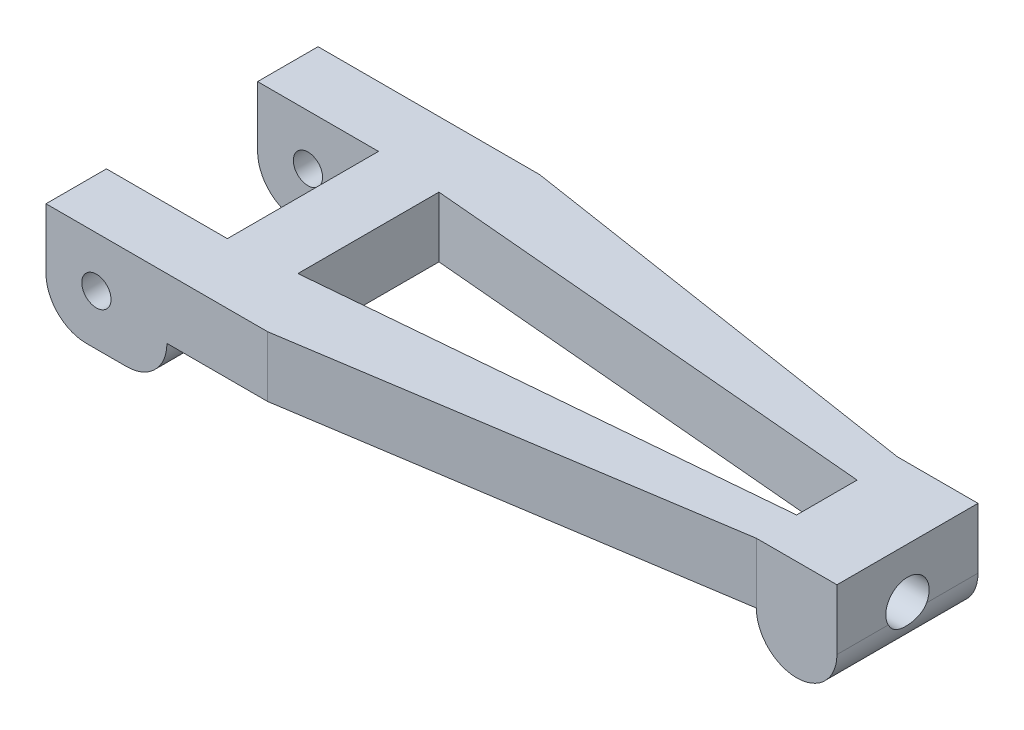
ISO-10303-21;
HEADER;
FILE_DESCRIPTION(('STEP AP214'),'2;1');
FILE_NAME('part.step','',(''),(''),'','','');
FILE_SCHEMA(('AUTOMOTIVE_DESIGN { 1 0 10303 214 1 1 1 1 }'));
ENDSEC;
DATA;
#1=APPLICATION_CONTEXT('core data for automotive mechanical design processes');
#2=APPLICATION_PROTOCOL_DEFINITION('international standard','automotive_design',2000,#1);
#3=PRODUCT_CONTEXT('',#1,'mechanical');
#4=PRODUCT('Part','Part','',(#3));
#5=PRODUCT_RELATED_PRODUCT_CATEGORY('part','',(#4));
#6=PRODUCT_DEFINITION_FORMATION('','',#4);
#7=PRODUCT_DEFINITION_CONTEXT('part definition',#1,'design');
#8=PRODUCT_DEFINITION('design','',#6,#7);
#9=PRODUCT_DEFINITION_SHAPE('','',#8);
#10=(LENGTH_UNIT() NAMED_UNIT(*) SI_UNIT(.MILLI.,.METRE.));
#11=(NAMED_UNIT(*) PLANE_ANGLE_UNIT() SI_UNIT($,.RADIAN.));
#12=(NAMED_UNIT(*) SI_UNIT($,.STERADIAN.) SOLID_ANGLE_UNIT());
#13=UNCERTAINTY_MEASURE_WITH_UNIT(LENGTH_MEASURE(1.E-05),#10,'distance_accuracy_value','');
#14=(GEOMETRIC_REPRESENTATION_CONTEXT(3) GLOBAL_UNCERTAINTY_ASSIGNED_CONTEXT((#13)) GLOBAL_UNIT_ASSIGNED_CONTEXT((#10,
#11,#12)) REPRESENTATION_CONTEXT('',''));
#15=CARTESIAN_POINT('',(0.,0.,0.));
#16=DIRECTION('',(0.,0.,1.));
#17=DIRECTION('',(1.,0.,0.));
#18=AXIS2_PLACEMENT_3D('',#15,#16,#17);
#19=CARTESIAN_POINT('',(0.,0.,0.));
#20=DIRECTION('',(0.,1.,0.));
#21=DIRECTION('',(0.,0.,1.));
#22=AXIS2_PLACEMENT_3D('',#19,#20,#21);
#23=PLANE('',#22);
#24=DIRECTION('',(0.,0.,-1.));
#25=VECTOR('',#24,1.);
#26=CARTESIAN_POINT('',(18.5,0.,20.5));
#27=LINE('',#26,#25);
#28=CARTESIAN_POINT('',(18.5,0.,20.5));
#29=VERTEX_POINT('',#28);
#30=CARTESIAN_POINT('',(18.5,0.,6.5));
#31=VERTEX_POINT('',#30);
#32=EDGE_CURVE('E224',#29,#31,#27,.T.);
#33=ORIENTED_EDGE('',*,*,#32,.F.);
#34=DIRECTION('',(-0.996157987955848,0.,0.0875743286115032));
#35=VECTOR('',#34,1.);
#36=CARTESIAN_POINT('',(64.,0.,16.5));
#37=LINE('',#36,#35);
#38=CARTESIAN_POINT('',(64.,0.,16.5));
#39=VERTEX_POINT('',#38);
#40=EDGE_CURVE('E203',#39,#29,#37,.T.);
#41=ORIENTED_EDGE('',*,*,#40,.F.);
#42=DIRECTION('',(0.,0.,-1.));
#43=VECTOR('',#42,1.);
#44=CARTESIAN_POINT('',(64.,0.,20.5));
#45=LINE('',#44,#43);
#46=CARTESIAN_POINT('',(64.,0.,20.5));
#47=VERTEX_POINT('',#46);
#48=EDGE_CURVE('E288',#47,#39,#45,.T.);
#49=ORIENTED_EDGE('',*,*,#48,.F.);
#50=DIRECTION('',(0.988235294117647,0.,-0.152941176470588));
#51=VECTOR('',#50,1.);
#52=CARTESIAN_POINT('',(64.,0.,20.5));
#53=LINE('',#52,#51);
#54=CARTESIAN_POINT('',(22.,0.,27.));
#55=VERTEX_POINT('',#54);
#56=EDGE_CURVE('E271',#55,#47,#53,.T.);
#57=ORIENTED_EDGE('',*,*,#56,.F.);
#58=DIRECTION('',(1.,0.,0.));
#59=VECTOR('',#58,1.);
#60=CARTESIAN_POINT('',(0.,0.,27.));
#61=LINE('',#60,#59);
#62=CARTESIAN_POINT('',(12.,0.,27.));
#63=VERTEX_POINT('',#62);
#64=EDGE_CURVE('E310',#63,#55,#61,.T.);
#65=ORIENTED_EDGE('',*,*,#64,.F.);
#66=DIRECTION('',(0.,0.,1.));
#67=VECTOR('',#66,1.);
#68=CARTESIAN_POINT('',(12.,0.,27.));
#69=LINE('',#68,#67);
#70=CARTESIAN_POINT('',(12.,0.,21.));
#71=VERTEX_POINT('',#70);
#72=EDGE_CURVE('E237',#71,#63,#69,.T.);
#73=ORIENTED_EDGE('',*,*,#72,.F.);
#74=DIRECTION('',(0.,0.,-1.));
#75=VECTOR('',#74,1.);
#76=CARTESIAN_POINT('',(12.,0.,21.));
#77=LINE('',#76,#75);
#78=CARTESIAN_POINT('',(12.,0.,6.));
#79=VERTEX_POINT('',#78);
#80=EDGE_CURVE('E296',#71,#79,#77,.T.);
#81=ORIENTED_EDGE('',*,*,#80,.T.);
#82=DIRECTION('',(0.,0.,1.));
#83=VECTOR('',#82,1.);
#84=CARTESIAN_POINT('',(12.,0.,0.));
#85=LINE('',#84,#83);
#86=CARTESIAN_POINT('',(12.,0.,0.));
#87=VERTEX_POINT('',#86);
#88=EDGE_CURVE('E248',#87,#79,#85,.T.);
#89=ORIENTED_EDGE('',*,*,#88,.F.);
#90=DIRECTION('',(-1.,0.,0.));
#91=VECTOR('',#90,1.);
#92=CARTESIAN_POINT('',(0.,0.,0.));
#93=LINE('',#92,#91);
#94=CARTESIAN_POINT('',(22.,0.,0.));
#95=VERTEX_POINT('',#94);
#96=EDGE_CURVE('E330',#95,#87,#93,.T.);
#97=ORIENTED_EDGE('',*,*,#96,.F.);
#98=DIRECTION('',(-0.988235294117647,0.,-0.152941176470588));
#99=VECTOR('',#98,1.);
#100=CARTESIAN_POINT('',(64.,0.,6.5));
#101=LINE('',#100,#99);
#102=CARTESIAN_POINT('',(64.,0.,6.5));
#103=VERTEX_POINT('',#102);
#104=EDGE_CURVE('E257',#103,#95,#101,.T.);
#105=ORIENTED_EDGE('',*,*,#104,.F.);
#106=CARTESIAN_POINT('',(64.,0.,10.5));
#107=VERTEX_POINT('',#106);
#108=EDGE_CURVE('E285',#107,#103,#45,.T.);
#109=ORIENTED_EDGE('',*,*,#108,.F.);
#110=DIRECTION('',(0.996157987955848,0.,0.0875743286115032));
#111=VECTOR('',#110,1.);
#112=CARTESIAN_POINT('',(18.5,0.,6.5));
#113=LINE('',#112,#111);
#114=EDGE_CURVE('E221',#31,#107,#113,.T.);
#115=ORIENTED_EDGE('',*,*,#114,.F.);
#116=EDGE_LOOP('',(#33,#41,#49,#57,#65,#73,#81,#89,#97,#105,#109,#115));
#117=FACE_BOUND('',#116,.T.);
#118=ADVANCED_FACE('F33',(#117),#23,.F.);
#119=CARTESIAN_POINT('',(0.,6.,0.));
#120=DIRECTION('',(1.,0.,0.));
#121=DIRECTION('',(0.,0.,-1.));
#122=AXIS2_PLACEMENT_3D('',#119,#120,#121);
#123=PLANE('',#122);
#124=DIRECTION('',(0.,-1.,0.));
#125=VECTOR('',#124,1.);
#126=CARTESIAN_POINT('',(0.,6.,0.));
#127=LINE('',#126,#125);
#128=CARTESIAN_POINT('',(0.,6.,0.));
#129=VERTEX_POINT('',#128);
#130=CARTESIAN_POINT('',(0.,0.,0.));
#131=VERTEX_POINT('',#130);
#132=EDGE_CURVE('E328',#129,#131,#127,.T.);
#133=ORIENTED_EDGE('',*,*,#132,.T.);
#134=DIRECTION('',(0.,0.,-1.));
#135=VECTOR('',#134,1.);
#136=CARTESIAN_POINT('',(0.,0.,0.));
#137=LINE('',#136,#135);
#138=CARTESIAN_POINT('',(0.,0.,6.));
#139=VERTEX_POINT('',#138);
#140=EDGE_CURVE('E49',#131,#139,#137,.F.);
#141=ORIENTED_EDGE('',*,*,#140,.T.);
#142=DIRECTION('',(0.,1.,0.));
#143=VECTOR('',#142,1.);
#144=CARTESIAN_POINT('',(0.,0.,6.));
#145=LINE('',#144,#143);
#146=CARTESIAN_POINT('',(0.,6.,6.));
#147=VERTEX_POINT('',#146);
#148=EDGE_CURVE('E308',#139,#147,#145,.T.);
#149=ORIENTED_EDGE('',*,*,#148,.T.);
#150=DIRECTION('',(0.,0.,1.));
#151=VECTOR('',#150,1.);
#152=CARTESIAN_POINT('',(0.,6.,0.));
#153=LINE('',#152,#151);
#154=EDGE_CURVE('E316',#129,#147,#153,.T.);
#155=ORIENTED_EDGE('',*,*,#154,.F.);
#156=EDGE_LOOP('',(#133,#141,#149,#155));
#157=FACE_BOUND('',#156,.T.);
#158=ADVANCED_FACE('F430',(#157),#123,.F.);
#159=DIRECTION('',(0.,1.,0.));
#160=VECTOR('',#159,1.);
#161=CARTESIAN_POINT('',(0.,0.,21.));
#162=LINE('',#161,#160);
#163=CARTESIAN_POINT('',(0.,0.,21.));
#164=VERTEX_POINT('',#163);
#165=CARTESIAN_POINT('',(0.,6.,21.));
#166=VERTEX_POINT('',#165);
#167=EDGE_CURVE('E299',#164,#166,#162,.T.);
#168=ORIENTED_EDGE('',*,*,#167,.F.);
#169=DIRECTION('',(0.,0.,-1.));
#170=VECTOR('',#169,1.);
#171=CARTESIAN_POINT('',(0.,0.,27.));
#172=LINE('',#171,#170);
#173=CARTESIAN_POINT('',(0.,0.,27.));
#174=VERTEX_POINT('',#173);
#175=EDGE_CURVE('E516',#164,#174,#172,.F.);
#176=ORIENTED_EDGE('',*,*,#175,.T.);
#177=DIRECTION('',(0.,-1.,0.));
#178=VECTOR('',#177,1.);
#179=CARTESIAN_POINT('',(0.,6.,27.));
#180=LINE('',#179,#178);
#181=CARTESIAN_POINT('',(0.,6.,27.));
#182=VERTEX_POINT('',#181);
#183=EDGE_CURVE('E334',#182,#174,#180,.T.);
#184=ORIENTED_EDGE('',*,*,#183,.F.);
#185=EDGE_CURVE('E320',#166,#182,#153,.T.);
#186=ORIENTED_EDGE('',*,*,#185,.F.);
#187=EDGE_LOOP('',(#168,#176,#184,#186));
#188=FACE_BOUND('',#187,.T.);
#189=ADVANCED_FACE('F442',(#188),#123,.F.);
#190=CARTESIAN_POINT('',(0.,6.,27.));
#191=DIRECTION('',(0.,0.,-1.));
#192=DIRECTION('',(-1.,0.,0.));
#193=AXIS2_PLACEMENT_3D('',#190,#191,#192);
#194=PLANE('',#193);
#195=CARTESIAN_POINT('',(5.,1.,27.));
#196=DIRECTION('',(0.,0.,-1.));
#197=DIRECTION('',(-1.,0.,0.));
#198=AXIS2_PLACEMENT_3D('',#195,#196,#197);
#199=CIRCLE('',#198,1.45);
#200=CARTESIAN_POINT('',(3.55,1.,27.));
#201=VERTEX_POINT('',#200);
#202=EDGE_CURVE('E344',#201,#201,#199,.T.);
#203=ORIENTED_EDGE('',*,*,#202,.T.);
#204=EDGE_LOOP('',(#203));
#205=FACE_BOUND('',#204,.T.);
#206=ORIENTED_EDGE('',*,*,#183,.T.);
#207=CARTESIAN_POINT('',(4.,0.,27.));
#208=DIRECTION('',(0.,0.,-1.));
#209=DIRECTION('',(-1.,0.,0.));
#210=AXIS2_PLACEMENT_3D('',#207,#208,#209);
#211=CIRCLE('',#210,4.);
#212=CARTESIAN_POINT('',(4.,-4.,27.));
#213=VERTEX_POINT('',#212);
#214=EDGE_CURVE('E512',#174,#213,#211,.F.);
#215=ORIENTED_EDGE('',*,*,#214,.T.);
#216=DIRECTION('',(-1.,0.,0.));
#217=VECTOR('',#216,1.);
#218=CARTESIAN_POINT('',(0.,-4.,27.));
#219=LINE('',#218,#217);
#220=CARTESIAN_POINT('',(8.,-4.,27.));
#221=VERTEX_POINT('',#220);
#222=EDGE_CURVE('E245',#221,#213,#219,.T.);
#223=ORIENTED_EDGE('',*,*,#222,.F.);
#224=CARTESIAN_POINT('',(8.,0.,27.));
#225=DIRECTION('',(0.,0.,-1.));
#226=DIRECTION('',(-1.,0.,0.));
#227=AXIS2_PLACEMENT_3D('',#224,#225,#226);
#228=CIRCLE('',#227,4.);
#229=EDGE_CURVE('E514',#221,#63,#228,.F.);
#230=ORIENTED_EDGE('',*,*,#229,.T.);
#231=ORIENTED_EDGE('',*,*,#64,.T.);
#232=DIRECTION('',(0.,-1.,0.));
#233=VECTOR('',#232,1.);
#234=CARTESIAN_POINT('',(22.,6.,27.));
#235=LINE('',#234,#233);
#236=CARTESIAN_POINT('',(22.,6.,27.));
#237=VERTEX_POINT('',#236);
#238=EDGE_CURVE('E280',#237,#55,#235,.T.);
#239=ORIENTED_EDGE('',*,*,#238,.F.);
#240=DIRECTION('',(1.,0.,0.));
#241=VECTOR('',#240,1.);
#242=CARTESIAN_POINT('',(0.,6.,27.));
#243=LINE('',#242,#241);
#244=EDGE_CURVE('E319',#182,#237,#243,.T.);
#245=ORIENTED_EDGE('',*,*,#244,.F.);
#246=EDGE_LOOP('',(#206,#215,#223,#230,#231,#239,#245));
#247=FACE_BOUND('',#246,.T.);
#248=ADVANCED_FACE('F438',(#205,#247),#194,.F.);
#249=CARTESIAN_POINT('',(72.,6.,0.));
#250=DIRECTION('',(-1.,0.,0.));
#251=DIRECTION('',(0.,0.,1.));
#252=AXIS2_PLACEMENT_3D('',#249,#250,#251);
#253=PLANE('',#252);
#254=DIRECTION('',(0.,1.,0.));
#255=VECTOR('',#254,1.);
#256=CARTESIAN_POINT('',(72.,-4.,20.5));
#257=LINE('',#256,#255);
#258=CARTESIAN_POINT('',(72.,0.,20.5));
#259=VERTEX_POINT('',#258);
#260=CARTESIAN_POINT('',(72.,6.,20.5));
#261=VERTEX_POINT('',#260);
#262=EDGE_CURVE('E293',#259,#261,#257,.T.);
#263=ORIENTED_EDGE('',*,*,#262,.F.);
#264=DIRECTION('',(0.,0.,1.));
#265=VECTOR('',#264,1.);
#266=CARTESIAN_POINT('',(72.,0.,0.));
#267=LINE('',#266,#265);
#268=CARTESIAN_POINT('',(72.,0.,15.4032866310674));
#269=VERTEX_POINT('',#268);
#270=EDGE_CURVE('E11',#259,#269,#267,.F.);
#271=ORIENTED_EDGE('',*,*,#270,.T.);
#272=CARTESIAN_POINT('',(72.,1.,13.5));
#273=DIRECTION('',(1.,0.,0.));
#274=DIRECTION('',(0.,0.,-1.));
#275=AXIS2_PLACEMENT_3D('',#272,#273,#274);
#276=CIRCLE('',#275,2.15);
#277=CARTESIAN_POINT('',(72.,0.,11.5967133689326));
#278=VERTEX_POINT('',#277);
#279=EDGE_CURVE('E227',#278,#269,#276,.T.);
#280=ORIENTED_EDGE('',*,*,#279,.F.);
#281=DIRECTION('',(0.,0.,1.));
#282=VECTOR('',#281,1.);
#283=CARTESIAN_POINT('',(72.,0.,0.));
#284=LINE('',#283,#282);
#285=CARTESIAN_POINT('',(72.,0.,6.5));
#286=VERTEX_POINT('',#285);
#287=EDGE_CURVE('E42',#278,#286,#284,.F.);
#288=ORIENTED_EDGE('',*,*,#287,.T.);
#289=DIRECTION('',(0.,1.,0.));
#290=VECTOR('',#289,1.);
#291=CARTESIAN_POINT('',(72.,-4.,6.5));
#292=LINE('',#291,#290);
#293=CARTESIAN_POINT('',(72.,6.,6.5));
#294=VERTEX_POINT('',#293);
#295=EDGE_CURVE('E291',#286,#294,#292,.T.);
#296=ORIENTED_EDGE('',*,*,#295,.T.);
#297=DIRECTION('',(0.,0.,-1.));
#298=VECTOR('',#297,1.);
#299=CARTESIAN_POINT('',(72.,6.,0.));
#300=LINE('',#299,#298);
#301=EDGE_CURVE('E323',#261,#294,#300,.T.);
#302=ORIENTED_EDGE('',*,*,#301,.F.);
#303=EDGE_LOOP('',(#263,#271,#280,#288,#296,#302));
#304=FACE_BOUND('',#303,.T.);
#305=ADVANCED_FACE('F434',(#304),#253,.F.);
#306=CARTESIAN_POINT('',(0.,6.,0.));
#307=DIRECTION('',(0.,0.,1.));
#308=DIRECTION('',(1.,0.,0.));
#309=AXIS2_PLACEMENT_3D('',#306,#307,#308);
#310=PLANE('',#309);
#311=CARTESIAN_POINT('',(5.,1.,0.));
#312=DIRECTION('',(0.,0.,-1.));
#313=DIRECTION('',(-1.,0.,0.));
#314=AXIS2_PLACEMENT_3D('',#311,#312,#313);
#315=CIRCLE('',#314,1.45);
#316=CARTESIAN_POINT('',(3.55,1.,0.));
#317=VERTEX_POINT('',#316);
#318=EDGE_CURVE('E481',#317,#317,#315,.T.);
#319=ORIENTED_EDGE('',*,*,#318,.F.);
#320=EDGE_LOOP('',(#319));
#321=FACE_BOUND('',#320,.T.);
#322=DIRECTION('',(1.,0.,0.));
#323=VECTOR('',#322,1.);
#324=CARTESIAN_POINT('',(0.,-4.,0.));
#325=LINE('',#324,#323);
#326=CARTESIAN_POINT('',(4.,-4.,0.));
#327=VERTEX_POINT('',#326);
#328=CARTESIAN_POINT('',(8.,-4.,0.));
#329=VERTEX_POINT('',#328);
#330=EDGE_CURVE('E251',#327,#329,#325,.T.);
#331=ORIENTED_EDGE('',*,*,#330,.F.);
#332=CARTESIAN_POINT('',(4.,0.,0.));
#333=DIRECTION('',(0.,0.,1.));
#334=DIRECTION('',(1.,0.,0.));
#335=AXIS2_PLACEMENT_3D('',#332,#333,#334);
#336=CIRCLE('',#335,4.);
#337=EDGE_CURVE('E57',#327,#131,#336,.F.);
#338=ORIENTED_EDGE('',*,*,#337,.T.);
#339=ORIENTED_EDGE('',*,*,#132,.F.);
#340=DIRECTION('',(-1.,0.,0.));
#341=VECTOR('',#340,1.);
#342=CARTESIAN_POINT('',(0.,6.,0.));
#343=LINE('',#342,#341);
#344=CARTESIAN_POINT('',(22.,6.,0.));
#345=VERTEX_POINT('',#344);
#346=EDGE_CURVE('E326',#345,#129,#343,.T.);
#347=ORIENTED_EDGE('',*,*,#346,.F.);
#348=DIRECTION('',(0.,-1.,0.));
#349=VECTOR('',#348,1.);
#350=CARTESIAN_POINT('',(22.,6.,0.));
#351=LINE('',#350,#349);
#352=EDGE_CURVE('E268',#345,#95,#351,.T.);
#353=ORIENTED_EDGE('',*,*,#352,.T.);
#354=ORIENTED_EDGE('',*,*,#96,.T.);
#355=CARTESIAN_POINT('',(8.,0.,0.));
#356=DIRECTION('',(0.,0.,1.));
#357=DIRECTION('',(1.,0.,0.));
#358=AXIS2_PLACEMENT_3D('',#355,#356,#357);
#359=CIRCLE('',#358,4.);
#360=EDGE_CURVE('E504',#87,#329,#359,.F.);
#361=ORIENTED_EDGE('',*,*,#360,.T.);
#362=EDGE_LOOP('',(#331,#338,#339,#347,#353,#354,#361));
#363=FACE_BOUND('',#362,.T.);
#364=ADVANCED_FACE('F427',(#321,#363),#310,.F.);
#365=CARTESIAN_POINT('',(0.,6.,0.));
#366=DIRECTION('',(0.,1.,0.));
#367=DIRECTION('',(0.,0.,1.));
#368=AXIS2_PLACEMENT_3D('',#365,#366,#367);
#369=PLANE('',#368);
#370=DIRECTION('',(-0.996157987955848,0.,0.0875743286115032));
#371=VECTOR('',#370,1.);
#372=CARTESIAN_POINT('',(64.,6.,16.5));
#373=LINE('',#372,#371);
#374=CARTESIAN_POINT('',(64.,6.,16.5));
#375=VERTEX_POINT('',#374);
#376=CARTESIAN_POINT('',(18.5,6.,20.5));
#377=VERTEX_POINT('',#376);
#378=EDGE_CURVE('E200',#375,#377,#373,.T.);
#379=ORIENTED_EDGE('',*,*,#378,.T.);
#380=DIRECTION('',(0.,0.,-1.));
#381=VECTOR('',#380,1.);
#382=CARTESIAN_POINT('',(18.5,6.,20.5));
#383=LINE('',#382,#381);
#384=CARTESIAN_POINT('',(18.5,6.,6.5));
#385=VERTEX_POINT('',#384);
#386=EDGE_CURVE('E212',#377,#385,#383,.T.);
#387=ORIENTED_EDGE('',*,*,#386,.T.);
#388=DIRECTION('',(0.996157987955848,0.,0.0875743286115032));
#389=VECTOR('',#388,1.);
#390=CARTESIAN_POINT('',(18.5,6.,6.5));
#391=LINE('',#390,#389);
#392=CARTESIAN_POINT('',(64.,6.,10.5));
#393=VERTEX_POINT('',#392);
#394=EDGE_CURVE('E216',#385,#393,#391,.T.);
#395=ORIENTED_EDGE('',*,*,#394,.T.);
#396=DIRECTION('',(0.,0.,1.));
#397=VECTOR('',#396,1.);
#398=CARTESIAN_POINT('',(64.,6.,10.5));
#399=LINE('',#398,#397);
#400=EDGE_CURVE('E208',#393,#375,#399,.T.);
#401=ORIENTED_EDGE('',*,*,#400,.T.);
#402=EDGE_LOOP('',(#379,#387,#395,#401));
#403=FACE_BOUND('',#402,.T.);
#404=DIRECTION('',(-1.,0.,0.));
#405=VECTOR('',#404,1.);
#406=CARTESIAN_POINT('',(72.,6.,6.5));
#407=LINE('',#406,#405);
#408=CARTESIAN_POINT('',(64.,6.,6.5));
#409=VERTEX_POINT('',#408);
#410=EDGE_CURVE('E260',#294,#409,#407,.T.);
#411=ORIENTED_EDGE('',*,*,#410,.T.);
#412=DIRECTION('',(-0.988235294117647,0.,-0.152941176470588));
#413=VECTOR('',#412,1.);
#414=CARTESIAN_POINT('',(64.,6.,6.5));
#415=LINE('',#414,#413);
#416=EDGE_CURVE('E263',#409,#345,#415,.T.);
#417=ORIENTED_EDGE('',*,*,#416,.T.);
#418=ORIENTED_EDGE('',*,*,#346,.T.);
#419=ORIENTED_EDGE('',*,*,#154,.T.);
#420=DIRECTION('',(-1.,0.,0.));
#421=VECTOR('',#420,1.);
#422=CARTESIAN_POINT('',(0.,6.,6.));
#423=LINE('',#422,#421);
#424=CARTESIAN_POINT('',(12.,6.,6.));
#425=VERTEX_POINT('',#424);
#426=EDGE_CURVE('E300',#425,#147,#423,.T.);
#427=ORIENTED_EDGE('',*,*,#426,.F.);
#428=DIRECTION('',(0.,0.,-1.));
#429=VECTOR('',#428,1.);
#430=CARTESIAN_POINT('',(12.,6.,21.));
#431=LINE('',#430,#429);
#432=CARTESIAN_POINT('',(12.,6.,21.));
#433=VERTEX_POINT('',#432);
#434=EDGE_CURVE('E303',#433,#425,#431,.T.);
#435=ORIENTED_EDGE('',*,*,#434,.F.);
#436=DIRECTION('',(1.,0.,0.));
#437=VECTOR('',#436,1.);
#438=CARTESIAN_POINT('',(0.,6.,21.));
#439=LINE('',#438,#437);
#440=EDGE_CURVE('E295',#166,#433,#439,.T.);
#441=ORIENTED_EDGE('',*,*,#440,.F.);
#442=ORIENTED_EDGE('',*,*,#185,.T.);
#443=ORIENTED_EDGE('',*,*,#244,.T.);
#444=DIRECTION('',(0.988235294117647,0.,-0.152941176470588));
#445=VECTOR('',#444,1.);
#446=CARTESIAN_POINT('',(64.,6.,20.5));
#447=LINE('',#446,#445);
#448=CARTESIAN_POINT('',(64.,6.,20.5));
#449=VERTEX_POINT('',#448);
#450=EDGE_CURVE('E277',#237,#449,#447,.T.);
#451=ORIENTED_EDGE('',*,*,#450,.T.);
#452=DIRECTION('',(1.,0.,0.));
#453=VECTOR('',#452,1.);
#454=CARTESIAN_POINT('',(72.,6.,20.5));
#455=LINE('',#454,#453);
#456=EDGE_CURVE('E274',#449,#261,#455,.T.);
#457=ORIENTED_EDGE('',*,*,#456,.T.);
#458=ORIENTED_EDGE('',*,*,#301,.T.);
#459=EDGE_LOOP('',(#411,#417,#418,#419,#427,#435,#441,#442,#443,#451,#457,#458));
#460=FACE_BOUND('',#459,.T.);
#461=ADVANCED_FACE('F218',(#403,#460),#369,.T.);
#462=CARTESIAN_POINT('',(0.,0.,6.));
#463=DIRECTION('',(0.,0.,-1.));
#464=DIRECTION('',(-1.,0.,0.));
#465=AXIS2_PLACEMENT_3D('',#462,#463,#464);
#466=PLANE('',#465);
#467=CARTESIAN_POINT('',(5.,1.,6.));
#468=DIRECTION('',(0.,0.,-1.));
#469=DIRECTION('',(-1.,0.,0.));
#470=AXIS2_PLACEMENT_3D('',#467,#468,#469);
#471=CIRCLE('',#470,1.45);
#472=CARTESIAN_POINT('',(3.55,1.,6.));
#473=VERTEX_POINT('',#472);
#474=EDGE_CURVE('E343',#473,#473,#471,.T.);
#475=ORIENTED_EDGE('',*,*,#474,.T.);
#476=EDGE_LOOP('',(#475));
#477=FACE_BOUND('',#476,.T.);
#478=ORIENTED_EDGE('',*,*,#148,.F.);
#479=CARTESIAN_POINT('',(4.,0.,6.));
#480=DIRECTION('',(0.,0.,-1.));
#481=DIRECTION('',(-1.,0.,0.));
#482=AXIS2_PLACEMENT_3D('',#479,#480,#481);
#483=CIRCLE('',#482,4.);
#484=CARTESIAN_POINT('',(4.,-4.,6.));
#485=VERTEX_POINT('',#484);
#486=EDGE_CURVE('E496',#139,#485,#483,.F.);
#487=ORIENTED_EDGE('',*,*,#486,.T.);
#488=DIRECTION('',(-1.,0.,0.));
#489=VECTOR('',#488,1.);
#490=CARTESIAN_POINT('',(0.,-4.,6.));
#491=LINE('',#490,#489);
#492=CARTESIAN_POINT('',(8.,-4.,6.));
#493=VERTEX_POINT('',#492);
#494=EDGE_CURVE('E254',#493,#485,#491,.T.);
#495=ORIENTED_EDGE('',*,*,#494,.F.);
#496=CARTESIAN_POINT('',(8.,0.,6.));
#497=DIRECTION('',(0.,0.,-1.));
#498=DIRECTION('',(-1.,0.,0.));
#499=AXIS2_PLACEMENT_3D('',#496,#497,#498);
#500=CIRCLE('',#499,4.);
#501=EDGE_CURVE('E498',#493,#79,#500,.F.);
#502=ORIENTED_EDGE('',*,*,#501,.T.);
#503=DIRECTION('',(0.,1.,0.));
#504=VECTOR('',#503,1.);
#505=CARTESIAN_POINT('',(12.,0.,6.));
#506=LINE('',#505,#504);
#507=EDGE_CURVE('E311',#79,#425,#506,.T.);
#508=ORIENTED_EDGE('',*,*,#507,.T.);
#509=ORIENTED_EDGE('',*,*,#426,.T.);
#510=EDGE_LOOP('',(#478,#487,#495,#502,#508,#509));
#511=FACE_BOUND('',#510,.T.);
#512=ADVANCED_FACE('F414',(#477,#511),#466,.F.);
#513=CARTESIAN_POINT('',(12.,0.,21.));
#514=DIRECTION('',(1.,0.,0.));
#515=DIRECTION('',(0.,0.,-1.));
#516=AXIS2_PLACEMENT_3D('',#513,#514,#515);
#517=PLANE('',#516);
#518=ORIENTED_EDGE('',*,*,#434,.T.);
#519=ORIENTED_EDGE('',*,*,#507,.F.);
#520=ORIENTED_EDGE('',*,*,#80,.F.);
#521=DIRECTION('',(0.,1.,0.));
#522=VECTOR('',#521,1.);
#523=CARTESIAN_POINT('',(12.,0.,21.));
#524=LINE('',#523,#522);
#525=EDGE_CURVE('E313',#71,#433,#524,.T.);
#526=ORIENTED_EDGE('',*,*,#525,.T.);
#527=EDGE_LOOP('',(#518,#519,#520,#526));
#528=FACE_BOUND('',#527,.T.);
#529=ADVANCED_FACE('F417',(#528),#517,.F.);
#530=CARTESIAN_POINT('',(0.,0.,21.));
#531=DIRECTION('',(0.,0.,1.));
#532=DIRECTION('',(1.,0.,0.));
#533=AXIS2_PLACEMENT_3D('',#530,#531,#532);
#534=PLANE('',#533);
#535=CARTESIAN_POINT('',(5.,1.,21.));
#536=DIRECTION('',(0.,0.,1.));
#537=DIRECTION('',(1.,0.,0.));
#538=AXIS2_PLACEMENT_3D('',#535,#536,#537);
#539=CIRCLE('',#538,1.45);
#540=CARTESIAN_POINT('',(6.45,1.,21.));
#541=VERTEX_POINT('',#540);
#542=EDGE_CURVE('E340',#541,#541,#539,.T.);
#543=ORIENTED_EDGE('',*,*,#542,.T.);
#544=EDGE_LOOP('',(#543));
#545=FACE_BOUND('',#544,.T.);
#546=DIRECTION('',(1.,0.,0.));
#547=VECTOR('',#546,1.);
#548=CARTESIAN_POINT('',(0.,-4.,21.));
#549=LINE('',#548,#547);
#550=CARTESIAN_POINT('',(4.,-4.,21.));
#551=VERTEX_POINT('',#550);
#552=CARTESIAN_POINT('',(8.,-4.,21.));
#553=VERTEX_POINT('',#552);
#554=EDGE_CURVE('E242',#551,#553,#549,.T.);
#555=ORIENTED_EDGE('',*,*,#554,.F.);
#556=CARTESIAN_POINT('',(4.,0.,21.));
#557=DIRECTION('',(0.,0.,1.));
#558=DIRECTION('',(1.,0.,0.));
#559=AXIS2_PLACEMENT_3D('',#556,#557,#558);
#560=CIRCLE('',#559,4.);
#561=EDGE_CURVE('E518',#551,#164,#560,.F.);
#562=ORIENTED_EDGE('',*,*,#561,.T.);
#563=ORIENTED_EDGE('',*,*,#167,.T.);
#564=ORIENTED_EDGE('',*,*,#440,.T.);
#565=ORIENTED_EDGE('',*,*,#525,.F.);
#566=CARTESIAN_POINT('',(8.,0.,21.));
#567=DIRECTION('',(0.,0.,1.));
#568=DIRECTION('',(1.,0.,0.));
#569=AXIS2_PLACEMENT_3D('',#566,#567,#568);
#570=CIRCLE('',#569,4.);
#571=EDGE_CURVE('E520',#71,#553,#570,.F.);
#572=ORIENTED_EDGE('',*,*,#571,.T.);
#573=EDGE_LOOP('',(#555,#562,#563,#564,#565,#572));
#574=FACE_BOUND('',#573,.T.);
#575=ADVANCED_FACE('F412',(#545,#574),#534,.F.);
#576=CARTESIAN_POINT('',(72.,-4.,20.5));
#577=DIRECTION('',(0.,0.,-1.));
#578=DIRECTION('',(-1.,0.,0.));
#579=AXIS2_PLACEMENT_3D('',#576,#577,#578);
#580=PLANE('',#579);
#581=DIRECTION('',(0.,-1.,0.));
#582=VECTOR('',#581,1.);
#583=CARTESIAN_POINT('',(64.,6.,20.5));
#584=LINE('',#583,#582);
#585=EDGE_CURVE('E282',#449,#47,#584,.T.);
#586=ORIENTED_EDGE('',*,*,#585,.T.);
#587=CARTESIAN_POINT('',(68.,0.,20.5));
#588=DIRECTION('',(0.,0.,-1.));
#589=DIRECTION('',(-1.,0.,0.));
#590=AXIS2_PLACEMENT_3D('',#587,#588,#589);
#591=CIRCLE('',#590,4.);
#592=CARTESIAN_POINT('',(68.,-4.,20.5));
#593=VERTEX_POINT('',#592);
#594=EDGE_CURVE('E479',#47,#593,#591,.F.);
#595=ORIENTED_EDGE('',*,*,#594,.T.);
#596=CARTESIAN_POINT('',(68.,0.,20.5));
#597=DIRECTION('',(0.,0.,-1.));
#598=DIRECTION('',(-1.,0.,0.));
#599=AXIS2_PLACEMENT_3D('',#596,#597,#598);
#600=CIRCLE('',#599,4.);
#601=EDGE_CURVE('E528',#593,#259,#600,.F.);
#602=ORIENTED_EDGE('',*,*,#601,.T.);
#603=ORIENTED_EDGE('',*,*,#262,.T.);
#604=ORIENTED_EDGE('',*,*,#456,.F.);
#605=EDGE_LOOP('',(#586,#595,#602,#603,#604));
#606=FACE_BOUND('',#605,.T.);
#607=ADVANCED_FACE('F408',(#606),#580,.F.);
#608=CARTESIAN_POINT('',(64.,-4.,20.5));
#609=DIRECTION('',(1.,0.,0.));
#610=DIRECTION('',(0.,0.,-1.));
#611=AXIS2_PLACEMENT_3D('',#608,#609,#610);
#612=PLANE('',#611);
#613=DIRECTION('',(0.,-1.,0.));
#614=VECTOR('',#613,1.);
#615=CARTESIAN_POINT('',(64.,6.,10.5));
#616=LINE('',#615,#614);
#617=EDGE_CURVE('E238',#393,#107,#616,.T.);
#618=ORIENTED_EDGE('',*,*,#617,.T.);
#619=DIRECTION('',(0.,0.,-1.));
#620=VECTOR('',#619,1.);
#621=CARTESIAN_POINT('',(64.,0.,20.5));
#622=LINE('',#621,#620);
#623=CARTESIAN_POINT('',(64.,0.,11.5967133689326));
#624=VERTEX_POINT('',#623);
#625=EDGE_CURVE('E350',#107,#624,#622,.F.);
#626=ORIENTED_EDGE('',*,*,#625,.T.);
#627=CARTESIAN_POINT('',(64.,1.,13.5));
#628=DIRECTION('',(1.,0.,0.));
#629=DIRECTION('',(0.,0.,-1.));
#630=AXIS2_PLACEMENT_3D('',#627,#628,#629);
#631=CIRCLE('',#630,2.15);
#632=CARTESIAN_POINT('',(64.,0.,15.4032866310674));
#633=VERTEX_POINT('',#632);
#634=EDGE_CURVE('E233',#624,#633,#631,.T.);
#635=ORIENTED_EDGE('',*,*,#634,.T.);
#636=DIRECTION('',(0.,0.,-1.));
#637=VECTOR('',#636,1.);
#638=CARTESIAN_POINT('',(64.,0.,20.5));
#639=LINE('',#638,#637);
#640=EDGE_CURVE('E348',#633,#39,#639,.F.);
#641=ORIENTED_EDGE('',*,*,#640,.T.);
#642=DIRECTION('',(0.,-1.,0.));
#643=VECTOR('',#642,1.);
#644=CARTESIAN_POINT('',(64.,6.,16.5));
#645=LINE('',#644,#643);
#646=EDGE_CURVE('E235',#375,#39,#645,.T.);
#647=ORIENTED_EDGE('',*,*,#646,.F.);
#648=ORIENTED_EDGE('',*,*,#400,.F.);
#649=EDGE_LOOP('',(#618,#626,#635,#641,#647,#648));
#650=FACE_BOUND('',#649,.T.);
#651=ADVANCED_FACE('F404',(#650),#612,.F.);
#652=CARTESIAN_POINT('',(72.,-4.,6.5));
#653=DIRECTION('',(0.,0.,1.));
#654=DIRECTION('',(1.,0.,0.));
#655=AXIS2_PLACEMENT_3D('',#652,#653,#654);
#656=PLANE('',#655);
#657=CARTESIAN_POINT('',(68.,0.,6.5));
#658=DIRECTION('',(0.,0.,1.));
#659=DIRECTION('',(1.,0.,0.));
#660=AXIS2_PLACEMENT_3D('',#657,#658,#659);
#661=CIRCLE('',#660,4.);
#662=CARTESIAN_POINT('',(68.,-4.,6.5));
#663=VERTEX_POINT('',#662);
#664=EDGE_CURVE('E337',#286,#663,#661,.F.);
#665=ORIENTED_EDGE('',*,*,#664,.T.);
#666=CARTESIAN_POINT('',(68.,0.,6.5));
#667=DIRECTION('',(0.,0.,1.));
#668=DIRECTION('',(1.,0.,0.));
#669=AXIS2_PLACEMENT_3D('',#666,#667,#668);
#670=CIRCLE('',#669,4.);
#671=EDGE_CURVE('E346',#663,#103,#670,.F.);
#672=ORIENTED_EDGE('',*,*,#671,.T.);
#673=DIRECTION('',(0.,-1.,0.));
#674=VECTOR('',#673,1.);
#675=CARTESIAN_POINT('',(64.,6.,6.5));
#676=LINE('',#675,#674);
#677=EDGE_CURVE('E266',#409,#103,#676,.T.);
#678=ORIENTED_EDGE('',*,*,#677,.F.);
#679=ORIENTED_EDGE('',*,*,#410,.F.);
#680=ORIENTED_EDGE('',*,*,#295,.F.);
#681=EDGE_LOOP('',(#665,#672,#678,#679,#680));
#682=FACE_BOUND('',#681,.T.);
#683=ADVANCED_FACE('F400',(#682),#656,.F.);
#684=CARTESIAN_POINT('',(64.,6.,20.5));
#685=DIRECTION('',(-0.152941176470588,0.,-0.988235294117647));
#686=DIRECTION('',(-0.988235294117647,0.,0.152941176470588));
#687=AXIS2_PLACEMENT_3D('',#684,#685,#686);
#688=PLANE('',#687);
#689=ORIENTED_EDGE('',*,*,#56,.T.);
#690=ORIENTED_EDGE('',*,*,#585,.F.);
#691=ORIENTED_EDGE('',*,*,#450,.F.);
#692=ORIENTED_EDGE('',*,*,#238,.T.);
#693=EDGE_LOOP('',(#689,#690,#691,#692));
#694=FACE_BOUND('',#693,.T.);
#695=ADVANCED_FACE('F396',(#694),#688,.F.);
#696=CARTESIAN_POINT('',(64.,6.,6.5));
#697=DIRECTION('',(-0.152941176470588,0.,0.988235294117647));
#698=DIRECTION('',(0.988235294117647,0.,0.152941176470588));
#699=AXIS2_PLACEMENT_3D('',#696,#697,#698);
#700=PLANE('',#699);
#701=ORIENTED_EDGE('',*,*,#104,.T.);
#702=ORIENTED_EDGE('',*,*,#352,.F.);
#703=ORIENTED_EDGE('',*,*,#416,.F.);
#704=ORIENTED_EDGE('',*,*,#677,.T.);
#705=EDGE_LOOP('',(#701,#702,#703,#704));
#706=FACE_BOUND('',#705,.T.);
#707=ADVANCED_FACE('F392',(#706),#700,.F.);
#708=CARTESIAN_POINT('',(0.,-4.,0.));
#709=DIRECTION('',(0.,1.,0.));
#710=DIRECTION('',(0.,0.,1.));
#711=AXIS2_PLACEMENT_3D('',#708,#709,#710);
#712=PLANE('',#711);
#713=ORIENTED_EDGE('',*,*,#494,.T.);
#714=DIRECTION('',(0.,0.,-1.));
#715=VECTOR('',#714,1.);
#716=CARTESIAN_POINT('',(4.,-4.,0.));
#717=LINE('',#716,#715);
#718=EDGE_CURVE('E506',#485,#327,#717,.T.);
#719=ORIENTED_EDGE('',*,*,#718,.T.);
#720=ORIENTED_EDGE('',*,*,#330,.T.);
#721=DIRECTION('',(0.,0.,1.));
#722=VECTOR('',#721,1.);
#723=CARTESIAN_POINT('',(8.,-4.,0.));
#724=LINE('',#723,#722);
#725=EDGE_CURVE('E509',#329,#493,#724,.T.);
#726=ORIENTED_EDGE('',*,*,#725,.T.);
#727=EDGE_LOOP('',(#713,#719,#720,#726));
#728=FACE_BOUND('',#727,.T.);
#729=ADVANCED_FACE('F388',(#728),#712,.F.);
#730=CARTESIAN_POINT('',(0.,-4.,0.));
#731=DIRECTION('',(0.,-1.,0.));
#732=DIRECTION('',(0.,0.,-1.));
#733=AXIS2_PLACEMENT_3D('',#730,#731,#732);
#734=PLANE('',#733);
#735=ORIENTED_EDGE('',*,*,#222,.T.);
#736=DIRECTION('',(0.,0.,-1.));
#737=VECTOR('',#736,1.);
#738=CARTESIAN_POINT('',(4.,-4.,21.));
#739=LINE('',#738,#737);
#740=EDGE_CURVE('E522',#213,#551,#739,.T.);
#741=ORIENTED_EDGE('',*,*,#740,.T.);
#742=ORIENTED_EDGE('',*,*,#554,.T.);
#743=DIRECTION('',(0.,0.,1.));
#744=VECTOR('',#743,1.);
#745=CARTESIAN_POINT('',(8.,-4.,27.));
#746=LINE('',#745,#744);
#747=EDGE_CURVE('E525',#553,#221,#746,.T.);
#748=ORIENTED_EDGE('',*,*,#747,.T.);
#749=EDGE_LOOP('',(#735,#741,#742,#748));
#750=FACE_BOUND('',#749,.T.);
#751=ADVANCED_FACE('F385',(#750),#734,.T.);
#752=CARTESIAN_POINT('',(64.,6.,16.5));
#753=DIRECTION('',(0.0875743286115032,0.,0.996157987955849));
#754=DIRECTION('',(0.996157987955849,0.,-0.0875743286115032));
#755=AXIS2_PLACEMENT_3D('',#752,#753,#754);
#756=PLANE('',#755);
#757=ORIENTED_EDGE('',*,*,#40,.T.);
#758=DIRECTION('',(0.,-1.,0.));
#759=VECTOR('',#758,1.);
#760=CARTESIAN_POINT('',(18.5,6.,20.5));
#761=LINE('',#760,#759);
#762=EDGE_CURVE('E195',#377,#29,#761,.T.);
#763=ORIENTED_EDGE('',*,*,#762,.F.);
#764=ORIENTED_EDGE('',*,*,#378,.F.);
#765=ORIENTED_EDGE('',*,*,#646,.T.);
#766=EDGE_LOOP('',(#757,#763,#764,#765));
#767=FACE_BOUND('',#766,.T.);
#768=ADVANCED_FACE('F197',(#767),#756,.F.);
#769=CARTESIAN_POINT('',(18.5,6.,6.5));
#770=DIRECTION('',(0.0875743286115032,0.,-0.996157987955849));
#771=DIRECTION('',(-0.996157987955849,0.,-0.0875743286115032));
#772=AXIS2_PLACEMENT_3D('',#769,#770,#771);
#773=PLANE('',#772);
#774=ORIENTED_EDGE('',*,*,#114,.T.);
#775=ORIENTED_EDGE('',*,*,#617,.F.);
#776=ORIENTED_EDGE('',*,*,#394,.F.);
#777=DIRECTION('',(0.,-1.,0.));
#778=VECTOR('',#777,1.);
#779=CARTESIAN_POINT('',(18.5,6.,6.5));
#780=LINE('',#779,#778);
#781=EDGE_CURVE('E207',#385,#31,#780,.T.);
#782=ORIENTED_EDGE('',*,*,#781,.T.);
#783=EDGE_LOOP('',(#774,#775,#776,#782));
#784=FACE_BOUND('',#783,.T.);
#785=ADVANCED_FACE('F376',(#784),#773,.F.);
#786=CARTESIAN_POINT('',(18.5,6.,20.5));
#787=DIRECTION('',(-1.,0.,0.));
#788=DIRECTION('',(0.,0.,1.));
#789=AXIS2_PLACEMENT_3D('',#786,#787,#788);
#790=PLANE('',#789);
#791=ORIENTED_EDGE('',*,*,#32,.T.);
#792=ORIENTED_EDGE('',*,*,#781,.F.);
#793=ORIENTED_EDGE('',*,*,#386,.F.);
#794=ORIENTED_EDGE('',*,*,#762,.T.);
#795=EDGE_LOOP('',(#791,#792,#793,#794));
#796=FACE_BOUND('',#795,.T.);
#797=ADVANCED_FACE('F213',(#796),#790,.F.);
#798=CARTESIAN_POINT('',(62.,1.,13.5));
#799=DIRECTION('',(1.,0.,0.));
#800=DIRECTION('',(0.,0.,-1.));
#801=AXIS2_PLACEMENT_3D('',#798,#799,#800);
#802=CYLINDRICAL_SURFACE('',#801,2.15);
#803=ORIENTED_EDGE('',*,*,#279,.T.);
#804=CARTESIAN_POINT('',(72.,0.,15.4032866310674));
#805=CARTESIAN_POINT('',(72.0000035970926,-0.0526138283198334,15.3756451962211));
#806=CARTESIAN_POINT('',(71.998961438773,-0.104044943070875,15.3458354552872));
#807=CARTESIAN_POINT('',(71.9950980562661,-0.204196517051123,15.282114566695));
#808=CARTESIAN_POINT('',(71.9922777038389,-0.252918291805665,15.2482054353443));
#809=CARTESIAN_POINT('',(71.9816383497176,-0.394278506719549,15.1408649283329));
#810=CARTESIAN_POINT('',(71.9716370917063,-0.482449432506335,15.0616423043409));
#811=CARTESIAN_POINT('',(71.9486209725238,-0.64427685795992,14.8902355149746));
#812=CARTESIAN_POINT('',(71.9356098874066,-0.717951331953773,14.7980676468299));
#813=CARTESIAN_POINT('',(71.9093697636776,-0.849305596403663,14.6029067391727));
#814=CARTESIAN_POINT('',(71.8961406139684,-0.906976949050168,14.4999080283025));
#815=CARTESIAN_POINT('',(71.8716847221307,-1.00636916170746,14.2821515635375));
#816=CARTESIAN_POINT('',(71.8605362912047,-1.04751581275021,14.1671217514435));
#817=CARTESIAN_POINT('',(71.8431012465366,-1.10979007804837,13.9314262629472));
#818=CARTESIAN_POINT('',(71.8368127873553,-1.13092529177803,13.8107627442629));
#819=CARTESIAN_POINT('',(71.8305063826381,-1.15210269242039,13.5709222845159));
#820=CARTESIAN_POINT('',(71.830314031189,-1.15273156844495,13.4518017205123));
#821=CARTESIAN_POINT('',(71.835794650906,-1.1343577771492,13.2152344031512));
#822=CARTESIAN_POINT('',(71.8414672899475,-1.11535622146698,13.0977875553957));
#823=CARTESIAN_POINT('',(71.857378206425,-1.05898942764976,12.8702997346519));
#824=CARTESIAN_POINT('',(71.8675211031571,-1.02200624136784,12.7601566234432));
#825=CARTESIAN_POINT('',(71.8904442454197,-0.930933502352441,12.5474287143023));
#826=CARTESIAN_POINT('',(71.9032259643482,-0.876834383839226,12.4448481825818));
#827=CARTESIAN_POINT('',(71.9295152329553,-0.75048580741833,12.2459162305137));
#828=CARTESIAN_POINT('',(71.9430316708455,-0.677611896045682,12.1499626223049));
#829=CARTESIAN_POINT('',(71.9673149375723,-0.516714954425912,11.9714481283608));
#830=CARTESIAN_POINT('',(71.9780855753571,-0.428713196449561,11.8888687486981));
#831=CARTESIAN_POINT('',(71.99037751713,-0.282189825402545,11.7728853943741));
#832=CARTESIAN_POINT('',(71.9938810971677,-0.228087740162849,11.7340069394594));
#833=CARTESIAN_POINT('',(71.9986947905059,-0.116485424619714,11.6614158769036));
#834=CARTESIAN_POINT('',(72.0000063709581,-0.0589874939355054,11.627699827696));
#835=CARTESIAN_POINT('',(72.,0.,11.5967133689326));
#836=B_SPLINE_CURVE_WITH_KNOTS('',3,(#804,#805,#806,#807,#808,#809,#810,#811,#812,#813,#814,
#815,#816,#817,#818,#819,#820,#821,#822,#823,#824,#825,#826,#827,#828,#829,#830,#831,#832,#833,
#834,#835),.UNSPECIFIED.,.F.,.F.,(4,2,2,2,2,2,2,2,2,2,2,2,2,2,2,4),(0.,0.178167803508415,
0.356248328050474,0.711279697236434,1.06586804564532,1.42064300067283,1.78685626940654,
2.15293041041032,2.50852164302606,2.86409274021624,3.2124190111733,3.56094030019036,
3.92302578231581,4.28460621567746,4.48446021368201,4.68418039153064),.UNSPECIFIED.);
#837=EDGE_CURVE('E352',#269,#278,#836,.T.);
#838=ORIENTED_EDGE('',*,*,#837,.T.);
#839=EDGE_LOOP('',(#803,#838));
#840=FACE_BOUND('',#839,.T.);
#841=ORIENTED_EDGE('',*,*,#634,.F.);
#842=CARTESIAN_POINT('',(64.,0.,11.5967133689326));
#843=CARTESIAN_POINT('',(63.9999964029074,-0.0526138283198334,11.6243548037789));
#844=CARTESIAN_POINT('',(64.001038561227,-0.104044943070875,11.6541645447128));
#845=CARTESIAN_POINT('',(64.0049019437339,-0.204196517051123,11.717885433305));
#846=CARTESIAN_POINT('',(64.0077222961611,-0.252918291805665,11.7517945646557));
#847=CARTESIAN_POINT('',(64.0183616502824,-0.394278506719549,11.8591350716671));
#848=CARTESIAN_POINT('',(64.0283629082937,-0.482449432506335,11.9383576956591));
#849=CARTESIAN_POINT('',(64.0513790274762,-0.64427685795992,12.1097644850254));
#850=CARTESIAN_POINT('',(64.0643901125934,-0.717951331953773,12.2019323531701));
#851=CARTESIAN_POINT('',(64.0906302363224,-0.849305596403663,12.3970932608273));
#852=CARTESIAN_POINT('',(64.1038593860316,-0.906976949050168,12.5000919716975));
#853=CARTESIAN_POINT('',(64.1283152778693,-1.00636916170746,12.7178484364625));
#854=CARTESIAN_POINT('',(64.1394637087953,-1.04751581275021,12.8328782485565));
#855=CARTESIAN_POINT('',(64.1568987534634,-1.10979007804837,13.0685737370528));
#856=CARTESIAN_POINT('',(64.1631872126447,-1.13092529177803,13.1892372557371));
#857=CARTESIAN_POINT('',(64.1694936173619,-1.15210269242039,13.4290777154841));
#858=CARTESIAN_POINT('',(64.169685968811,-1.15273156844495,13.5481982794877));
#859=CARTESIAN_POINT('',(64.164205349094,-1.1343577771492,13.7847655968488));
#860=CARTESIAN_POINT('',(64.1585327100525,-1.11535622146698,13.9022124446043));
#861=CARTESIAN_POINT('',(64.142621793575,-1.05898942764976,14.1297002653481));
#862=CARTESIAN_POINT('',(64.1324788968429,-1.02200624136784,14.2398433765568));
#863=CARTESIAN_POINT('',(64.1095557545803,-0.930933502352441,14.4525712856977));
#864=CARTESIAN_POINT('',(64.0967740356518,-0.876834383839225,14.5551518174182));
#865=CARTESIAN_POINT('',(64.0704847670447,-0.75048580741833,14.7540837694863));
#866=CARTESIAN_POINT('',(64.0569683291545,-0.677611896045682,14.8500373776951));
#867=CARTESIAN_POINT('',(64.0326850624277,-0.516714954425912,15.0285518716392));
#868=CARTESIAN_POINT('',(64.0219144246429,-0.428713196449561,15.1111312513019));
#869=CARTESIAN_POINT('',(64.00962248287,-0.282189825402545,15.2271146056259));
#870=CARTESIAN_POINT('',(64.0061189028323,-0.228087740162849,15.2659930605406));
#871=CARTESIAN_POINT('',(64.001305209494,-0.116485424619714,15.3385841230964));
#872=CARTESIAN_POINT('',(63.9999936290419,-0.0589874939355054,15.372300172304));
#873=CARTESIAN_POINT('',(64.,0.,15.4032866310674));
#874=B_SPLINE_CURVE_WITH_KNOTS('',3,(#842,#843,#844,#845,#846,#847,#848,#849,#850,#851,#852,
#853,#854,#855,#856,#857,#858,#859,#860,#861,#862,#863,#864,#865,#866,#867,#868,#869,#870,#871,
#872,#873),.UNSPECIFIED.,.F.,.F.,(4,2,2,2,2,2,2,2,2,2,2,2,2,2,2,4),(0.,0.178167803508415,
0.356248328050474,0.711279697236434,1.06586804564532,1.42064300067283,1.78685626940654,
2.15293041041032,2.50852164302606,2.86409274021624,3.2124190111733,3.56094030019036,
3.92302578231581,4.28460621567746,4.48446021368201,4.68418039153064),.UNSPECIFIED.);
#875=EDGE_CURVE('E359',#624,#633,#874,.T.);
#876=ORIENTED_EDGE('',*,*,#875,.T.);
#877=EDGE_LOOP('',(#841,#876));
#878=FACE_BOUND('',#877,.T.);
#879=ADVANCED_FACE('F368',(#840,#878),#802,.F.);
#880=CARTESIAN_POINT('',(5.,1.,27.));
#881=DIRECTION('',(0.,0.,-1.));
#882=DIRECTION('',(-1.,0.,0.));
#883=AXIS2_PLACEMENT_3D('',#880,#881,#882);
#884=CYLINDRICAL_SURFACE('',#883,1.45);
#885=ORIENTED_EDGE('',*,*,#202,.F.);
#886=EDGE_LOOP('',(#885));
#887=FACE_BOUND('',#886,.T.);
#888=ORIENTED_EDGE('',*,*,#542,.F.);
#889=EDGE_LOOP('',(#888));
#890=FACE_BOUND('',#889,.T.);
#891=ADVANCED_FACE('F373',(#887,#890),#884,.F.);
#892=ORIENTED_EDGE('',*,*,#318,.T.);
#893=EDGE_LOOP('',(#892));
#894=FACE_BOUND('',#893,.T.);
#895=ORIENTED_EDGE('',*,*,#474,.F.);
#896=EDGE_LOOP('',(#895));
#897=FACE_BOUND('',#896,.T.);
#898=ADVANCED_FACE('F375',(#894,#897),#884,.F.);
#899=CARTESIAN_POINT('',(68.,0.,0.));
#900=DIRECTION('',(0.,0.,1.));
#901=DIRECTION('',(1.,0.,0.));
#902=AXIS2_PLACEMENT_3D('',#899,#900,#901);
#903=CYLINDRICAL_SURFACE('',#902,4.);
#904=ORIENTED_EDGE('',*,*,#270,.F.);
#905=ORIENTED_EDGE('',*,*,#601,.F.);
#906=DIRECTION('',(0.,0.,1.));
#907=VECTOR('',#906,1.);
#908=CARTESIAN_POINT('',(68.,-4.,0.));
#909=LINE('',#908,#907);
#910=EDGE_CURVE('E37',#663,#593,#909,.T.);
#911=ORIENTED_EDGE('',*,*,#910,.F.);
#912=ORIENTED_EDGE('',*,*,#664,.F.);
#913=ORIENTED_EDGE('',*,*,#287,.F.);
#914=ORIENTED_EDGE('',*,*,#837,.F.);
#915=EDGE_LOOP('',(#904,#905,#911,#912,#913,#914));
#916=FACE_BOUND('',#915,.T.);
#917=ADVANCED_FACE('F365',(#916),#903,.T.);
#918=CARTESIAN_POINT('',(68.,0.,0.));
#919=DIRECTION('',(0.,0.,-1.));
#920=DIRECTION('',(-1.,0.,0.));
#921=AXIS2_PLACEMENT_3D('',#918,#919,#920);
#922=CYLINDRICAL_SURFACE('',#921,4.);
#923=ORIENTED_EDGE('',*,*,#625,.F.);
#924=ORIENTED_EDGE('',*,*,#108,.T.);
#925=ORIENTED_EDGE('',*,*,#671,.F.);
#926=ORIENTED_EDGE('',*,*,#910,.T.);
#927=ORIENTED_EDGE('',*,*,#594,.F.);
#928=ORIENTED_EDGE('',*,*,#48,.T.);
#929=ORIENTED_EDGE('',*,*,#640,.F.);
#930=ORIENTED_EDGE('',*,*,#875,.F.);
#931=EDGE_LOOP('',(#923,#924,#925,#926,#927,#928,#929,#930));
#932=FACE_BOUND('',#931,.T.);
#933=ADVANCED_FACE('F446',(#932),#922,.T.);
#934=CARTESIAN_POINT('',(4.,0.,0.));
#935=DIRECTION('',(0.,0.,1.));
#936=DIRECTION('',(1.,0.,0.));
#937=AXIS2_PLACEMENT_3D('',#934,#935,#936);
#938=CYLINDRICAL_SURFACE('',#937,4.);
#939=ORIENTED_EDGE('',*,*,#214,.F.);
#940=ORIENTED_EDGE('',*,*,#175,.F.);
#941=ORIENTED_EDGE('',*,*,#561,.F.);
#942=ORIENTED_EDGE('',*,*,#740,.F.);
#943=EDGE_LOOP('',(#939,#940,#941,#942));
#944=FACE_BOUND('',#943,.T.);
#945=ADVANCED_FACE('F449',(#944),#938,.T.);
#946=CARTESIAN_POINT('',(4.,0.,0.));
#947=DIRECTION('',(0.,0.,-1.));
#948=DIRECTION('',(-1.,0.,0.));
#949=AXIS2_PLACEMENT_3D('',#946,#947,#948);
#950=CYLINDRICAL_SURFACE('',#949,4.);
#951=ORIENTED_EDGE('',*,*,#486,.F.);
#952=ORIENTED_EDGE('',*,*,#140,.F.);
#953=ORIENTED_EDGE('',*,*,#337,.F.);
#954=ORIENTED_EDGE('',*,*,#718,.F.);
#955=EDGE_LOOP('',(#951,#952,#953,#954));
#956=FACE_BOUND('',#955,.T.);
#957=ADVANCED_FACE('F455',(#956),#950,.T.);
#958=CARTESIAN_POINT('',(8.,0.,0.));
#959=DIRECTION('',(0.,0.,1.));
#960=DIRECTION('',(1.,0.,0.));
#961=AXIS2_PLACEMENT_3D('',#958,#959,#960);
#962=CYLINDRICAL_SURFACE('',#961,4.);
#963=ORIENTED_EDGE('',*,*,#360,.F.);
#964=ORIENTED_EDGE('',*,*,#88,.T.);
#965=ORIENTED_EDGE('',*,*,#501,.F.);
#966=ORIENTED_EDGE('',*,*,#725,.F.);
#967=EDGE_LOOP('',(#963,#964,#965,#966));
#968=FACE_BOUND('',#967,.T.);
#969=ADVANCED_FACE('F552',(#968),#962,.T.);
#970=CARTESIAN_POINT('',(8.,0.,0.));
#971=DIRECTION('',(0.,0.,-1.));
#972=DIRECTION('',(-1.,0.,0.));
#973=AXIS2_PLACEMENT_3D('',#970,#971,#972);
#974=CYLINDRICAL_SURFACE('',#973,4.);
#975=ORIENTED_EDGE('',*,*,#571,.F.);
#976=ORIENTED_EDGE('',*,*,#72,.T.);
#977=ORIENTED_EDGE('',*,*,#229,.F.);
#978=ORIENTED_EDGE('',*,*,#747,.F.);
#979=EDGE_LOOP('',(#975,#976,#977,#978));
#980=FACE_BOUND('',#979,.T.);
#981=ADVANCED_FACE('F35',(#980),#974,.T.);
#982=CLOSED_SHELL('',(#118,#158,#189,#248,#305,#364,#461,#512,#529,#575,#607,#651,#683,#695,
#707,#729,#751,#768,#785,#797,#879,#891,#898,#917,#933,#945,#957,#969,#981));
#983=MANIFOLD_SOLID_BREP('B2',#982);
#984=ADVANCED_BREP_SHAPE_REPRESENTATION('',(#18,#983),#14);
#985=SHAPE_DEFINITION_REPRESENTATION(#9,#984);
ENDSEC;
END-ISO-10303-21;
